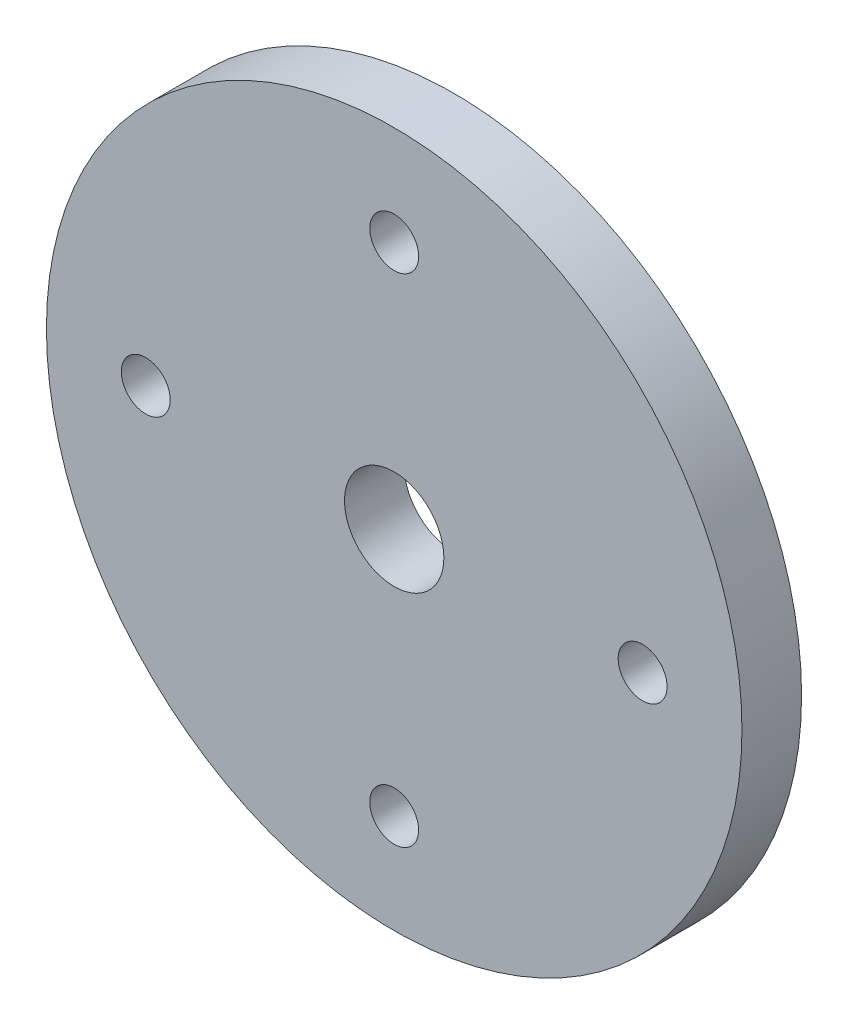
ISO-10303-21;
HEADER;
FILE_DESCRIPTION(('STEP AP214'),'2;1');
FILE_NAME('part.step','',(''),(''),'','','');
FILE_SCHEMA(('AUTOMOTIVE_DESIGN { 1 0 10303 214 1 1 1 1 }'));
ENDSEC;
DATA;
#1=APPLICATION_CONTEXT('core data for automotive mechanical design processes');
#2=APPLICATION_PROTOCOL_DEFINITION('international standard','automotive_design',2000,#1);
#3=PRODUCT_CONTEXT('',#1,'mechanical');
#4=PRODUCT('Part','Part','',(#3));
#5=PRODUCT_RELATED_PRODUCT_CATEGORY('part','',(#4));
#6=PRODUCT_DEFINITION_FORMATION('','',#4);
#7=PRODUCT_DEFINITION_CONTEXT('part definition',#1,'design');
#8=PRODUCT_DEFINITION('design','',#6,#7);
#9=PRODUCT_DEFINITION_SHAPE('','',#8);
#10=(LENGTH_UNIT() NAMED_UNIT(*) SI_UNIT(.MILLI.,.METRE.));
#11=(NAMED_UNIT(*) PLANE_ANGLE_UNIT() SI_UNIT($,.RADIAN.));
#12=(NAMED_UNIT(*) SI_UNIT($,.STERADIAN.) SOLID_ANGLE_UNIT());
#13=UNCERTAINTY_MEASURE_WITH_UNIT(LENGTH_MEASURE(1.E-05),#10,'distance_accuracy_value','');
#14=(GEOMETRIC_REPRESENTATION_CONTEXT(3) GLOBAL_UNCERTAINTY_ASSIGNED_CONTEXT((#13)) GLOBAL_UNIT_ASSIGNED_CONTEXT((#10,
#11,#12)) REPRESENTATION_CONTEXT('',''));
#15=CARTESIAN_POINT('',(0.,0.,0.));
#16=DIRECTION('',(0.,0.,1.));
#17=DIRECTION('',(1.,0.,0.));
#18=AXIS2_PLACEMENT_3D('',#15,#16,#17);
#19=CARTESIAN_POINT('',(0.,0.,3.));
#20=DIRECTION('',(0.,0.,1.));
#21=DIRECTION('',(1.,0.,0.));
#22=AXIS2_PLACEMENT_3D('',#19,#20,#21);
#23=PLANE('',#22);
#24=CARTESIAN_POINT('',(7.05950310263298E-13,-12.5,3.));
#25=DIRECTION('',(0.,0.,1.));
#26=DIRECTION('',(1.,0.,0.));
#27=AXIS2_PLACEMENT_3D('',#24,#25,#26);
#28=CIRCLE('',#27,1.23000000000076);
#29=CARTESIAN_POINT('',(1.23000000000146,-12.5,3.));
#30=VERTEX_POINT('',#29);
#31=EDGE_CURVE('E74',#30,#30,#28,.T.);
#32=ORIENTED_EDGE('',*,*,#31,.F.);
#33=EDGE_LOOP('',(#32));
#34=FACE_BOUND('',#33,.T.);
#35=CARTESIAN_POINT('',(0.,12.5,3.));
#36=DIRECTION('',(0.,0.,1.));
#37=DIRECTION('',(1.,0.,0.));
#38=AXIS2_PLACEMENT_3D('',#35,#36,#37);
#39=CIRCLE('',#38,1.23);
#40=CARTESIAN_POINT('',(1.23,12.5,3.));
#41=VERTEX_POINT('',#40);
#42=EDGE_CURVE('E58',#41,#41,#39,.T.);
#43=ORIENTED_EDGE('',*,*,#42,.F.);
#44=EDGE_LOOP('',(#43));
#45=FACE_BOUND('',#44,.T.);
#46=CARTESIAN_POINT('',(0.,0.,3.));
#47=DIRECTION('',(0.,0.,1.));
#48=DIRECTION('',(1.,0.,0.));
#49=AXIS2_PLACEMENT_3D('',#46,#47,#48);
#50=CIRCLE('',#49,17.5);
#51=CARTESIAN_POINT('',(17.5,0.,3.));
#52=VERTEX_POINT('',#51);
#53=EDGE_CURVE('E10',#52,#52,#50,.T.);
#54=ORIENTED_EDGE('',*,*,#53,.T.);
#55=EDGE_LOOP('',(#54));
#56=FACE_BOUND('',#55,.T.);
#57=CARTESIAN_POINT('',(0.,0.,3.));
#58=DIRECTION('',(0.,0.,1.));
#59=DIRECTION('',(1.,0.,0.));
#60=AXIS2_PLACEMENT_3D('',#57,#58,#59);
#61=CIRCLE('',#60,2.5);
#62=CARTESIAN_POINT('',(2.5,0.,3.));
#63=VERTEX_POINT('',#62);
#64=EDGE_CURVE('E52',#63,#63,#61,.T.);
#65=ORIENTED_EDGE('',*,*,#64,.F.);
#66=EDGE_LOOP('',(#65));
#67=FACE_BOUND('',#66,.T.);
#68=CARTESIAN_POINT('',(12.5000000000004,3.52975155131649E-13,3.));
#69=DIRECTION('',(0.,0.,1.));
#70=DIRECTION('',(1.,0.,0.));
#71=AXIS2_PLACEMENT_3D('',#68,#69,#70);
#72=CIRCLE('',#71,1.23000000000028);
#73=CARTESIAN_POINT('',(13.7300000000006,3.52975155131649E-13,3.));
#74=VERTEX_POINT('',#73);
#75=EDGE_CURVE('E66',#74,#74,#72,.T.);
#76=ORIENTED_EDGE('',*,*,#75,.F.);
#77=EDGE_LOOP('',(#76));
#78=FACE_BOUND('',#77,.T.);
#79=CARTESIAN_POINT('',(-12.4999999999996,-3.54505963630583E-13,3.));
#80=DIRECTION('',(0.,0.,1.));
#81=DIRECTION('',(1.,0.,0.));
#82=AXIS2_PLACEMENT_3D('',#79,#80,#81);
#83=CIRCLE('',#82,1.23000000000057);
#84=CARTESIAN_POINT('',(-11.2699999999991,-3.54505963630583E-13,3.));
#85=VERTEX_POINT('',#84);
#86=EDGE_CURVE('E82',#85,#85,#83,.T.);
#87=ORIENTED_EDGE('',*,*,#86,.F.);
#88=EDGE_LOOP('',(#87));
#89=FACE_BOUND('',#88,.T.);
#90=ADVANCED_FACE('F39',(#34,#45,#56,#67,#78,#89),#23,.T.);
#91=CARTESIAN_POINT('',(0.,0.,0.));
#92=DIRECTION('',(0.,0.,1.));
#93=DIRECTION('',(1.,0.,0.));
#94=AXIS2_PLACEMENT_3D('',#91,#92,#93);
#95=PLANE('',#94);
#96=CARTESIAN_POINT('',(0.,0.,0.));
#97=DIRECTION('',(0.,0.,1.));
#98=DIRECTION('',(1.,0.,0.));
#99=AXIS2_PLACEMENT_3D('',#96,#97,#98);
#100=CIRCLE('',#99,17.5);
#101=CARTESIAN_POINT('',(17.5,0.,0.));
#102=VERTEX_POINT('',#101);
#103=EDGE_CURVE('E43',#102,#102,#100,.T.);
#104=ORIENTED_EDGE('',*,*,#103,.F.);
#105=EDGE_LOOP('',(#104));
#106=FACE_BOUND('',#105,.T.);
#107=CARTESIAN_POINT('',(0.,0.,0.));
#108=DIRECTION('',(0.,0.,1.));
#109=DIRECTION('',(1.,0.,0.));
#110=AXIS2_PLACEMENT_3D('',#107,#108,#109);
#111=CIRCLE('',#110,2.5);
#112=CARTESIAN_POINT('',(2.5,0.,0.));
#113=VERTEX_POINT('',#112);
#114=EDGE_CURVE('E54',#113,#113,#111,.T.);
#115=ORIENTED_EDGE('',*,*,#114,.T.);
#116=EDGE_LOOP('',(#115));
#117=FACE_BOUND('',#116,.T.);
#118=CARTESIAN_POINT('',(0.,12.5,0.));
#119=DIRECTION('',(0.,0.,1.));
#120=DIRECTION('',(1.,0.,0.));
#121=AXIS2_PLACEMENT_3D('',#118,#119,#120);
#122=CIRCLE('',#121,1.23);
#123=CARTESIAN_POINT('',(1.23,12.5,0.));
#124=VERTEX_POINT('',#123);
#125=EDGE_CURVE('E62',#124,#124,#122,.T.);
#126=ORIENTED_EDGE('',*,*,#125,.T.);
#127=EDGE_LOOP('',(#126));
#128=FACE_BOUND('',#127,.T.);
#129=CARTESIAN_POINT('',(12.5000000000004,3.52975155131649E-13,0.));
#130=DIRECTION('',(0.,0.,1.));
#131=DIRECTION('',(1.,0.,0.));
#132=AXIS2_PLACEMENT_3D('',#129,#130,#131);
#133=CIRCLE('',#132,1.23000000000028);
#134=CARTESIAN_POINT('',(13.7300000000006,3.52975155131649E-13,0.));
#135=VERTEX_POINT('',#134);
#136=EDGE_CURVE('E70',#135,#135,#133,.T.);
#137=ORIENTED_EDGE('',*,*,#136,.T.);
#138=EDGE_LOOP('',(#137));
#139=FACE_BOUND('',#138,.T.);
#140=CARTESIAN_POINT('',(7.05950310263298E-13,-12.5,0.));
#141=DIRECTION('',(0.,0.,1.));
#142=DIRECTION('',(1.,0.,0.));
#143=AXIS2_PLACEMENT_3D('',#140,#141,#142);
#144=CIRCLE('',#143,1.23000000000076);
#145=CARTESIAN_POINT('',(1.23000000000146,-12.5,0.));
#146=VERTEX_POINT('',#145);
#147=EDGE_CURVE('E78',#146,#146,#144,.T.);
#148=ORIENTED_EDGE('',*,*,#147,.T.);
#149=EDGE_LOOP('',(#148));
#150=FACE_BOUND('',#149,.T.);
#151=CARTESIAN_POINT('',(-12.4999999999996,-3.54505963630583E-13,0.));
#152=DIRECTION('',(0.,0.,1.));
#153=DIRECTION('',(1.,0.,0.));
#154=AXIS2_PLACEMENT_3D('',#151,#152,#153);
#155=CIRCLE('',#154,1.23000000000057);
#156=CARTESIAN_POINT('',(-11.2699999999991,-3.54505963630583E-13,0.));
#157=VERTEX_POINT('',#156);
#158=EDGE_CURVE('E86',#157,#157,#155,.T.);
#159=ORIENTED_EDGE('',*,*,#158,.T.);
#160=EDGE_LOOP('',(#159));
#161=FACE_BOUND('',#160,.T.);
#162=ADVANCED_FACE('F98',(#106,#117,#128,#139,#150,#161),#95,.F.);
#163=CARTESIAN_POINT('',(0.,0.,3.));
#164=DIRECTION('',(0.,0.,-1.));
#165=DIRECTION('',(-1.,0.,0.));
#166=AXIS2_PLACEMENT_3D('',#163,#164,#165);
#167=CYLINDRICAL_SURFACE('',#166,17.5);
#168=ORIENTED_EDGE('',*,*,#53,.F.);
#169=EDGE_LOOP('',(#168));
#170=FACE_BOUND('',#169,.T.);
#171=ORIENTED_EDGE('',*,*,#103,.T.);
#172=EDGE_LOOP('',(#171));
#173=FACE_BOUND('',#172,.T.);
#174=ADVANCED_FACE('F41',(#170,#173),#167,.T.);
#175=CARTESIAN_POINT('',(0.,0.,3.));
#176=DIRECTION('',(0.,0.,-1.));
#177=DIRECTION('',(-1.,0.,0.));
#178=AXIS2_PLACEMENT_3D('',#175,#176,#177);
#179=CYLINDRICAL_SURFACE('',#178,2.5);
#180=ORIENTED_EDGE('',*,*,#64,.T.);
#181=EDGE_LOOP('',(#180));
#182=FACE_BOUND('',#181,.T.);
#183=ORIENTED_EDGE('',*,*,#114,.F.);
#184=EDGE_LOOP('',(#183));
#185=FACE_BOUND('',#184,.T.);
#186=ADVANCED_FACE('F108',(#182,#185),#179,.F.);
#187=CARTESIAN_POINT('',(0.,12.5,3.));
#188=DIRECTION('',(0.,0.,-1.));
#189=DIRECTION('',(-1.,0.,0.));
#190=AXIS2_PLACEMENT_3D('',#187,#188,#189);
#191=CYLINDRICAL_SURFACE('',#190,1.23);
#192=ORIENTED_EDGE('',*,*,#42,.T.);
#193=EDGE_LOOP('',(#192));
#194=FACE_BOUND('',#193,.T.);
#195=ORIENTED_EDGE('',*,*,#125,.F.);
#196=EDGE_LOOP('',(#195));
#197=FACE_BOUND('',#196,.T.);
#198=ADVANCED_FACE('F111',(#194,#197),#191,.F.);
#199=CARTESIAN_POINT('',(12.5000000000004,3.52975155131649E-13,3.));
#200=DIRECTION('',(0.,0.,-1.));
#201=DIRECTION('',(-1.,0.,0.));
#202=AXIS2_PLACEMENT_3D('',#199,#200,#201);
#203=CYLINDRICAL_SURFACE('',#202,1.23000000000028);
#204=ORIENTED_EDGE('',*,*,#75,.T.);
#205=EDGE_LOOP('',(#204));
#206=FACE_BOUND('',#205,.T.);
#207=ORIENTED_EDGE('',*,*,#136,.F.);
#208=EDGE_LOOP('',(#207));
#209=FACE_BOUND('',#208,.T.);
#210=ADVANCED_FACE('F115',(#206,#209),#203,.F.);
#211=CARTESIAN_POINT('',(7.05950310263298E-13,-12.5,3.));
#212=DIRECTION('',(0.,0.,-1.));
#213=DIRECTION('',(-1.,0.,0.));
#214=AXIS2_PLACEMENT_3D('',#211,#212,#213);
#215=CYLINDRICAL_SURFACE('',#214,1.23000000000076);
#216=ORIENTED_EDGE('',*,*,#31,.T.);
#217=EDGE_LOOP('',(#216));
#218=FACE_BOUND('',#217,.T.);
#219=ORIENTED_EDGE('',*,*,#147,.F.);
#220=EDGE_LOOP('',(#219));
#221=FACE_BOUND('',#220,.T.);
#222=ADVANCED_FACE('F119',(#218,#221),#215,.F.);
#223=CARTESIAN_POINT('',(-12.4999999999996,-3.54505963630583E-13,3.));
#224=DIRECTION('',(0.,0.,-1.));
#225=DIRECTION('',(-1.,0.,0.));
#226=AXIS2_PLACEMENT_3D('',#223,#224,#225);
#227=CYLINDRICAL_SURFACE('',#226,1.23000000000057);
#228=ORIENTED_EDGE('',*,*,#86,.T.);
#229=EDGE_LOOP('',(#228));
#230=FACE_BOUND('',#229,.T.);
#231=ORIENTED_EDGE('',*,*,#158,.F.);
#232=EDGE_LOOP('',(#231));
#233=FACE_BOUND('',#232,.T.);
#234=ADVANCED_FACE('F94',(#230,#233),#227,.F.);
#235=CLOSED_SHELL('',(#90,#162,#174,#186,#198,#210,#222,#234));
#236=MANIFOLD_SOLID_BREP('B2',#235);
#237=ADVANCED_BREP_SHAPE_REPRESENTATION('',(#18,#236),#14);
#238=SHAPE_DEFINITION_REPRESENTATION(#9,#237);
ENDSEC;
END-ISO-10303-21;
